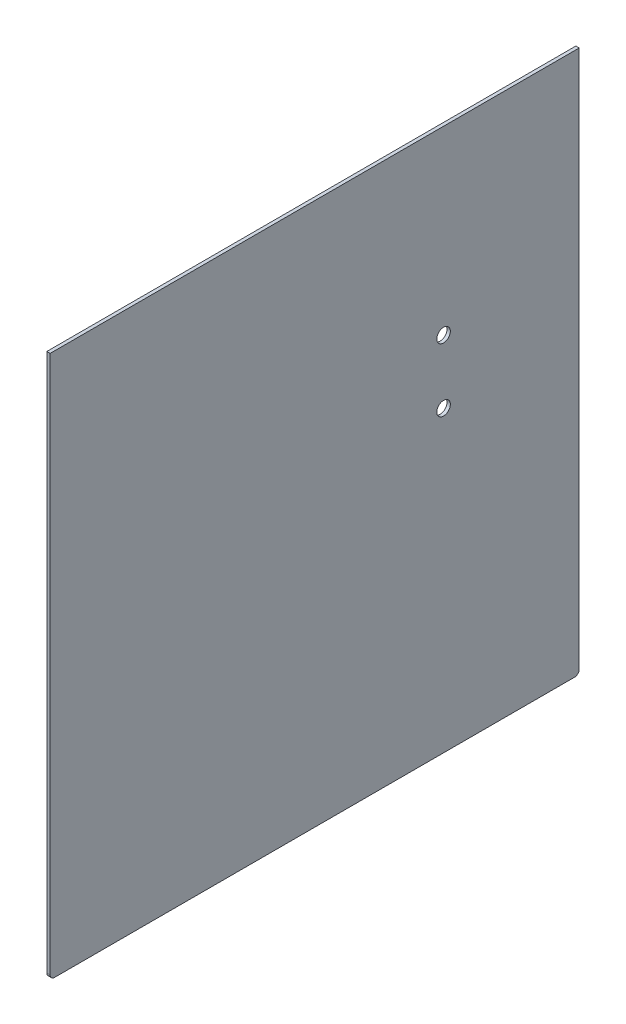
ISO-10303-21;
HEADER;
FILE_DESCRIPTION(('STEP AP214'),'2;1');
FILE_NAME('part.step','',(''),(''),'','','');
FILE_SCHEMA(('AUTOMOTIVE_DESIGN { 1 0 10303 214 1 1 1 1 }'));
ENDSEC;
DATA;
#1=APPLICATION_CONTEXT('core data for automotive mechanical design processes');
#2=APPLICATION_PROTOCOL_DEFINITION('international standard','automotive_design',2000,#1);
#3=PRODUCT_CONTEXT('',#1,'mechanical');
#4=PRODUCT('Part','Part','',(#3));
#5=PRODUCT_RELATED_PRODUCT_CATEGORY('part','',(#4));
#6=PRODUCT_DEFINITION_FORMATION('','',#4);
#7=PRODUCT_DEFINITION_CONTEXT('part definition',#1,'design');
#8=PRODUCT_DEFINITION('design','',#6,#7);
#9=PRODUCT_DEFINITION_SHAPE('','',#8);
#10=(LENGTH_UNIT() NAMED_UNIT(*) SI_UNIT(.MILLI.,.METRE.));
#11=(NAMED_UNIT(*) PLANE_ANGLE_UNIT() SI_UNIT($,.RADIAN.));
#12=(NAMED_UNIT(*) SI_UNIT($,.STERADIAN.) SOLID_ANGLE_UNIT());
#13=UNCERTAINTY_MEASURE_WITH_UNIT(LENGTH_MEASURE(1.E-05),#10,'distance_accuracy_value','');
#14=(GEOMETRIC_REPRESENTATION_CONTEXT(3) GLOBAL_UNCERTAINTY_ASSIGNED_CONTEXT((#13)) GLOBAL_UNIT_ASSIGNED_CONTEXT((#10,
#11,#12)) REPRESENTATION_CONTEXT('',''));
#15=CARTESIAN_POINT('',(0.,0.,0.));
#16=DIRECTION('',(0.,0.,1.));
#17=DIRECTION('',(1.,0.,0.));
#18=AXIS2_PLACEMENT_3D('',#15,#16,#17);
#19=CARTESIAN_POINT('',(-0.7366,-60.,58.5));
#20=DIRECTION('',(0.,0.,1.));
#21=DIRECTION('',(1.,0.,0.));
#22=AXIS2_PLACEMENT_3D('',#19,#20,#21);
#23=PLANE('',#22);
#24=DIRECTION('',(0.,-1.,0.));
#25=VECTOR('',#24,1.);
#26=CARTESIAN_POINT('',(-0.7366,-60.,58.5));
#27=LINE('',#26,#25);
#28=CARTESIAN_POINT('',(-0.7366,60.,58.5));
#29=VERTEX_POINT('',#28);
#30=CARTESIAN_POINT('',(-0.7366,-59.,58.5));
#31=VERTEX_POINT('',#30);
#32=EDGE_CURVE('E110',#29,#31,#27,.T.);
#33=ORIENTED_EDGE('',*,*,#32,.T.);
#34=DIRECTION('',(1.,0.,0.));
#35=VECTOR('',#34,1.);
#36=CARTESIAN_POINT('',(-0.7366,-59.,58.5));
#37=LINE('',#36,#35);
#38=CARTESIAN_POINT('',(0.,-59.,58.5));
#39=VERTEX_POINT('',#38);
#40=EDGE_CURVE('E123',#31,#39,#37,.T.);
#41=ORIENTED_EDGE('',*,*,#40,.T.);
#42=DIRECTION('',(0.,-1.,0.));
#43=VECTOR('',#42,1.);
#44=CARTESIAN_POINT('',(0.,-60.,58.5));
#45=LINE('',#44,#43);
#46=CARTESIAN_POINT('',(0.,60.,58.5));
#47=VERTEX_POINT('',#46);
#48=EDGE_CURVE('E114',#47,#39,#45,.T.);
#49=ORIENTED_EDGE('',*,*,#48,.F.);
#50=DIRECTION('',(1.,0.,0.));
#51=VECTOR('',#50,1.);
#52=CARTESIAN_POINT('',(-0.7366,60.,58.5));
#53=LINE('',#52,#51);
#54=EDGE_CURVE('E105',#29,#47,#53,.T.);
#55=ORIENTED_EDGE('',*,*,#54,.F.);
#56=EDGE_LOOP('',(#33,#41,#49,#55));
#57=FACE_BOUND('',#56,.T.);
#58=ADVANCED_FACE('F38',(#57),#23,.T.);
#59=CARTESIAN_POINT('',(-0.7366,60.,-58.5));
#60=DIRECTION('',(0.,1.,0.));
#61=DIRECTION('',(0.,0.,1.));
#62=AXIS2_PLACEMENT_3D('',#59,#60,#61);
#63=PLANE('',#62);
#64=DIRECTION('',(0.,0.,1.));
#65=VECTOR('',#64,1.);
#66=CARTESIAN_POINT('',(0.,60.,-58.5));
#67=LINE('',#66,#65);
#68=CARTESIAN_POINT('',(0.,60.,-58.5));
#69=VERTEX_POINT('',#68);
#70=EDGE_CURVE('E104',#69,#47,#67,.T.);
#71=ORIENTED_EDGE('',*,*,#70,.F.);
#72=DIRECTION('',(1.,0.,0.));
#73=VECTOR('',#72,1.);
#74=CARTESIAN_POINT('',(-0.7366,60.,-58.5));
#75=LINE('',#74,#73);
#76=CARTESIAN_POINT('',(-0.7366,60.,-58.5));
#77=VERTEX_POINT('',#76);
#78=EDGE_CURVE('E92',#77,#69,#75,.T.);
#79=ORIENTED_EDGE('',*,*,#78,.F.);
#80=DIRECTION('',(0.,0.,1.));
#81=VECTOR('',#80,1.);
#82=CARTESIAN_POINT('',(-0.7366,60.,-58.5));
#83=LINE('',#82,#81);
#84=EDGE_CURVE('E97',#77,#29,#83,.T.);
#85=ORIENTED_EDGE('',*,*,#84,.T.);
#86=ORIENTED_EDGE('',*,*,#54,.T.);
#87=EDGE_LOOP('',(#71,#79,#85,#86));
#88=FACE_BOUND('',#87,.T.);
#89=ADVANCED_FACE('F102',(#88),#63,.T.);
#90=CARTESIAN_POINT('',(-0.7366,-60.,-58.5));
#91=DIRECTION('',(0.,0.,-1.));
#92=DIRECTION('',(-1.,0.,0.));
#93=AXIS2_PLACEMENT_3D('',#90,#91,#92);
#94=PLANE('',#93);
#95=DIRECTION('',(0.,1.,0.));
#96=VECTOR('',#95,1.);
#97=CARTESIAN_POINT('',(0.,-60.,-58.5));
#98=LINE('',#97,#96);
#99=CARTESIAN_POINT('',(0.,-59.,-58.5));
#100=VERTEX_POINT('',#99);
#101=EDGE_CURVE('E120',#100,#69,#98,.T.);
#102=ORIENTED_EDGE('',*,*,#101,.F.);
#103=DIRECTION('',(1.,0.,0.));
#104=VECTOR('',#103,1.);
#105=CARTESIAN_POINT('',(-0.7366,-59.,-58.5));
#106=LINE('',#105,#104);
#107=CARTESIAN_POINT('',(-0.7366,-59.,-58.5));
#108=VERTEX_POINT('',#107);
#109=EDGE_CURVE('E47',#100,#108,#106,.F.);
#110=ORIENTED_EDGE('',*,*,#109,.T.);
#111=DIRECTION('',(0.,1.,0.));
#112=VECTOR('',#111,1.);
#113=CARTESIAN_POINT('',(-0.7366,-60.,-58.5));
#114=LINE('',#113,#112);
#115=EDGE_CURVE('E89',#108,#77,#114,.T.);
#116=ORIENTED_EDGE('',*,*,#115,.T.);
#117=ORIENTED_EDGE('',*,*,#78,.T.);
#118=EDGE_LOOP('',(#102,#110,#116,#117));
#119=FACE_BOUND('',#118,.T.);
#120=ADVANCED_FACE('F91',(#119),#94,.T.);
#121=CARTESIAN_POINT('',(-0.7366,-60.,-58.5));
#122=DIRECTION('',(0.,-1.,0.));
#123=DIRECTION('',(0.,0.,-1.));
#124=AXIS2_PLACEMENT_3D('',#121,#122,#123);
#125=PLANE('',#124);
#126=DIRECTION('',(0.,0.,-1.));
#127=VECTOR('',#126,1.);
#128=CARTESIAN_POINT('',(-0.7366,-60.,-58.5));
#129=LINE('',#128,#127);
#130=CARTESIAN_POINT('',(-0.7366,-60.,57.5));
#131=VERTEX_POINT('',#130);
#132=CARTESIAN_POINT('',(-0.7366,-60.,-57.5));
#133=VERTEX_POINT('',#132);
#134=EDGE_CURVE('E98',#131,#133,#129,.T.);
#135=ORIENTED_EDGE('',*,*,#134,.T.);
#136=DIRECTION('',(1.,0.,0.));
#137=VECTOR('',#136,1.);
#138=CARTESIAN_POINT('',(-0.7366,-60.,-57.5));
#139=LINE('',#138,#137);
#140=CARTESIAN_POINT('',(0.,-60.,-57.5));
#141=VERTEX_POINT('',#140);
#142=EDGE_CURVE('E133',#133,#141,#139,.T.);
#143=ORIENTED_EDGE('',*,*,#142,.T.);
#144=DIRECTION('',(0.,0.,-1.));
#145=VECTOR('',#144,1.);
#146=CARTESIAN_POINT('',(0.,-60.,-58.5));
#147=LINE('',#146,#145);
#148=CARTESIAN_POINT('',(0.,-60.,57.5));
#149=VERTEX_POINT('',#148);
#150=EDGE_CURVE('E117',#149,#141,#147,.T.);
#151=ORIENTED_EDGE('',*,*,#150,.F.);
#152=DIRECTION('',(1.,0.,0.));
#153=VECTOR('',#152,1.);
#154=CARTESIAN_POINT('',(-0.7366,-60.,57.5));
#155=LINE('',#154,#153);
#156=EDGE_CURVE('E129',#149,#131,#155,.F.);
#157=ORIENTED_EDGE('',*,*,#156,.T.);
#158=EDGE_LOOP('',(#135,#143,#151,#157));
#159=FACE_BOUND('',#158,.T.);
#160=ADVANCED_FACE('F153',(#159),#125,.T.);
#161=CARTESIAN_POINT('',(-0.7366,0.,0.));
#162=DIRECTION('',(1.,0.,0.));
#163=DIRECTION('',(0.,0.,-1.));
#164=AXIS2_PLACEMENT_3D('',#161,#162,#163);
#165=PLANE('',#164);
#166=CARTESIAN_POINT('',(-0.7366,5.99999999999998,-28.5));
#167=DIRECTION('',(-1.,0.,0.));
#168=DIRECTION('',(0.,0.,1.));
#169=AXIS2_PLACEMENT_3D('',#166,#167,#168);
#170=CIRCLE('',#169,1.5);
#171=CARTESIAN_POINT('',(-0.7366,5.99999999999998,-27.));
#172=VERTEX_POINT('',#171);
#173=EDGE_CURVE('E146',#172,#172,#170,.T.);
#174=ORIENTED_EDGE('',*,*,#173,.F.);
#175=EDGE_LOOP('',(#174));
#176=FACE_BOUND('',#175,.T.);
#177=CARTESIAN_POINT('',(-0.7366,20.,-28.5));
#178=DIRECTION('',(-1.,0.,0.));
#179=DIRECTION('',(0.,0.,1.));
#180=AXIS2_PLACEMENT_3D('',#177,#178,#179);
#181=CIRCLE('',#180,1.5);
#182=CARTESIAN_POINT('',(-0.7366,20.,-27.));
#183=VERTEX_POINT('',#182);
#184=EDGE_CURVE('E138',#183,#183,#181,.T.);
#185=ORIENTED_EDGE('',*,*,#184,.F.);
#186=EDGE_LOOP('',(#185));
#187=FACE_BOUND('',#186,.T.);
#188=ORIENTED_EDGE('',*,*,#115,.F.);
#189=CARTESIAN_POINT('',(-0.7366,-59.,-57.5));
#190=DIRECTION('',(1.,0.,0.));
#191=DIRECTION('',(0.,0.,-1.));
#192=AXIS2_PLACEMENT_3D('',#189,#190,#191);
#193=CIRCLE('',#192,1.);
#194=EDGE_CURVE('E11',#108,#133,#193,.F.);
#195=ORIENTED_EDGE('',*,*,#194,.T.);
#196=ORIENTED_EDGE('',*,*,#134,.F.);
#197=CARTESIAN_POINT('',(-0.7366,-59.,57.5));
#198=DIRECTION('',(1.,0.,0.));
#199=DIRECTION('',(0.,0.,-1.));
#200=AXIS2_PLACEMENT_3D('',#197,#198,#199);
#201=CIRCLE('',#200,1.);
#202=EDGE_CURVE('E131',#131,#31,#201,.F.);
#203=ORIENTED_EDGE('',*,*,#202,.T.);
#204=ORIENTED_EDGE('',*,*,#32,.F.);
#205=ORIENTED_EDGE('',*,*,#84,.F.);
#206=EDGE_LOOP('',(#188,#195,#196,#203,#204,#205));
#207=FACE_BOUND('',#206,.T.);
#208=ADVANCED_FACE('F108',(#176,#187,#207),#165,.F.);
#209=CARTESIAN_POINT('',(0.,0.,0.));
#210=DIRECTION('',(1.,0.,0.));
#211=DIRECTION('',(0.,0.,-1.));
#212=AXIS2_PLACEMENT_3D('',#209,#210,#211);
#213=PLANE('',#212);
#214=CARTESIAN_POINT('',(0.,5.99999999999998,-28.5));
#215=DIRECTION('',(1.,0.,0.));
#216=DIRECTION('',(0.,0.,-1.));
#217=AXIS2_PLACEMENT_3D('',#214,#215,#216);
#218=CIRCLE('',#217,1.5);
#219=CARTESIAN_POINT('',(0.,5.99999999999998,-30.));
#220=VERTEX_POINT('',#219);
#221=EDGE_CURVE('E42',#220,#220,#218,.T.);
#222=ORIENTED_EDGE('',*,*,#221,.F.);
#223=EDGE_LOOP('',(#222));
#224=FACE_BOUND('',#223,.T.);
#225=CARTESIAN_POINT('',(0.,20.,-28.5));
#226=DIRECTION('',(1.,0.,0.));
#227=DIRECTION('',(0.,0.,-1.));
#228=AXIS2_PLACEMENT_3D('',#225,#226,#227);
#229=CIRCLE('',#228,1.5);
#230=CARTESIAN_POINT('',(0.,20.,-30.));
#231=VERTEX_POINT('',#230);
#232=EDGE_CURVE('E118',#231,#231,#229,.T.);
#233=ORIENTED_EDGE('',*,*,#232,.F.);
#234=EDGE_LOOP('',(#233));
#235=FACE_BOUND('',#234,.T.);
#236=ORIENTED_EDGE('',*,*,#150,.T.);
#237=CARTESIAN_POINT('',(0.,-59.,-57.5));
#238=DIRECTION('',(1.,0.,0.));
#239=DIRECTION('',(0.,0.,-1.));
#240=AXIS2_PLACEMENT_3D('',#237,#238,#239);
#241=CIRCLE('',#240,1.);
#242=EDGE_CURVE('E62',#141,#100,#241,.T.);
#243=ORIENTED_EDGE('',*,*,#242,.T.);
#244=ORIENTED_EDGE('',*,*,#101,.T.);
#245=ORIENTED_EDGE('',*,*,#70,.T.);
#246=ORIENTED_EDGE('',*,*,#48,.T.);
#247=CARTESIAN_POINT('',(0.,-59.,57.5));
#248=DIRECTION('',(1.,0.,0.));
#249=DIRECTION('',(0.,0.,-1.));
#250=AXIS2_PLACEMENT_3D('',#247,#248,#249);
#251=CIRCLE('',#250,1.);
#252=EDGE_CURVE('E127',#39,#149,#251,.T.);
#253=ORIENTED_EDGE('',*,*,#252,.T.);
#254=EDGE_LOOP('',(#236,#243,#244,#245,#246,#253));
#255=FACE_BOUND('',#254,.T.);
#256=ADVANCED_FACE('F167',(#224,#235,#255),#213,.T.);
#257=CARTESIAN_POINT('',(-0.7366,-59.,57.5));
#258=DIRECTION('',(1.,0.,0.));
#259=DIRECTION('',(0.,0.,-1.));
#260=AXIS2_PLACEMENT_3D('',#257,#258,#259);
#261=CYLINDRICAL_SURFACE('',#260,1.);
#262=ORIENTED_EDGE('',*,*,#202,.F.);
#263=ORIENTED_EDGE('',*,*,#156,.F.);
#264=ORIENTED_EDGE('',*,*,#252,.F.);
#265=ORIENTED_EDGE('',*,*,#40,.F.);
#266=EDGE_LOOP('',(#262,#263,#264,#265));
#267=FACE_BOUND('',#266,.T.);
#268=ADVANCED_FACE('F160',(#267),#261,.T.);
#269=CARTESIAN_POINT('',(-0.7366,-59.,-57.5));
#270=DIRECTION('',(1.,0.,0.));
#271=DIRECTION('',(0.,0.,-1.));
#272=AXIS2_PLACEMENT_3D('',#269,#270,#271);
#273=CYLINDRICAL_SURFACE('',#272,1.);
#274=ORIENTED_EDGE('',*,*,#194,.F.);
#275=ORIENTED_EDGE('',*,*,#109,.F.);
#276=ORIENTED_EDGE('',*,*,#242,.F.);
#277=ORIENTED_EDGE('',*,*,#142,.F.);
#278=EDGE_LOOP('',(#274,#275,#276,#277));
#279=FACE_BOUND('',#278,.T.);
#280=ADVANCED_FACE('F40',(#279),#273,.T.);
#281=CARTESIAN_POINT('',(9.2634,20.,-28.5));
#282=DIRECTION('',(-1.,0.,0.));
#283=DIRECTION('',(0.,0.,1.));
#284=AXIS2_PLACEMENT_3D('',#281,#282,#283);
#285=CYLINDRICAL_SURFACE('',#284,1.5);
#286=ORIENTED_EDGE('',*,*,#232,.T.);
#287=EDGE_LOOP('',(#286));
#288=FACE_BOUND('',#287,.T.);
#289=ORIENTED_EDGE('',*,*,#184,.T.);
#290=EDGE_LOOP('',(#289));
#291=FACE_BOUND('',#290,.T.);
#292=ADVANCED_FACE('F159',(#288,#291),#285,.F.);
#293=CARTESIAN_POINT('',(9.2634,5.99999999999998,-28.5));
#294=DIRECTION('',(-1.,0.,0.));
#295=DIRECTION('',(0.,0.,1.));
#296=AXIS2_PLACEMENT_3D('',#293,#294,#295);
#297=CYLINDRICAL_SURFACE('',#296,1.5);
#298=ORIENTED_EDGE('',*,*,#221,.T.);
#299=EDGE_LOOP('',(#298));
#300=FACE_BOUND('',#299,.T.);
#301=ORIENTED_EDGE('',*,*,#173,.T.);
#302=EDGE_LOOP('',(#301));
#303=FACE_BOUND('',#302,.T.);
#304=ADVANCED_FACE('F165',(#300,#303),#297,.F.);
#305=CLOSED_SHELL('',(#58,#89,#120,#160,#208,#256,#268,#280,#292,#304));
#306=MANIFOLD_SOLID_BREP('B2',#305);
#307=ADVANCED_BREP_SHAPE_REPRESENTATION('',(#18,#306),#14);
#308=SHAPE_DEFINITION_REPRESENTATION(#9,#307);
ENDSEC;
END-ISO-10303-21;
